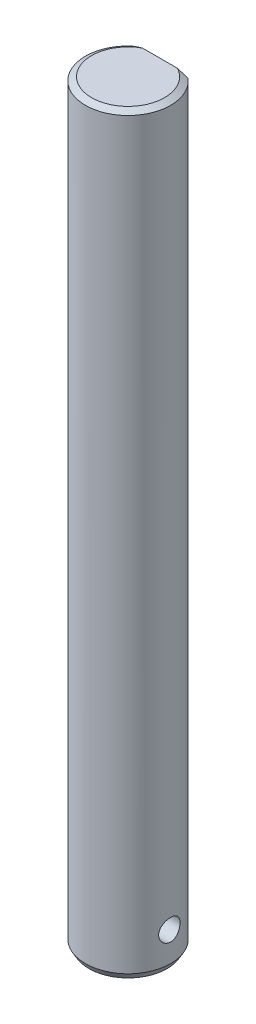
ISO-10303-21;
HEADER;
FILE_DESCRIPTION(('STEP AP214'),'2;1');
FILE_NAME('part.step','',(''),(''),'','','');
FILE_SCHEMA(('AUTOMOTIVE_DESIGN { 1 0 10303 214 1 1 1 1 }'));
ENDSEC;
DATA;
#1=APPLICATION_CONTEXT('core data for automotive mechanical design processes');
#2=APPLICATION_PROTOCOL_DEFINITION('international standard','automotive_design',2000,#1);
#3=PRODUCT_CONTEXT('',#1,'mechanical');
#4=PRODUCT('Part','Part','',(#3));
#5=PRODUCT_RELATED_PRODUCT_CATEGORY('part','',(#4));
#6=PRODUCT_DEFINITION_FORMATION('','',#4);
#7=PRODUCT_DEFINITION_CONTEXT('part definition',#1,'design');
#8=PRODUCT_DEFINITION('design','',#6,#7);
#9=PRODUCT_DEFINITION_SHAPE('','',#8);
#10=(LENGTH_UNIT() NAMED_UNIT(*) SI_UNIT(.MILLI.,.METRE.));
#11=(NAMED_UNIT(*) PLANE_ANGLE_UNIT() SI_UNIT($,.RADIAN.));
#12=(NAMED_UNIT(*) SI_UNIT($,.STERADIAN.) SOLID_ANGLE_UNIT());
#13=UNCERTAINTY_MEASURE_WITH_UNIT(LENGTH_MEASURE(1.E-05),#10,'distance_accuracy_value','');
#14=(GEOMETRIC_REPRESENTATION_CONTEXT(3) GLOBAL_UNCERTAINTY_ASSIGNED_CONTEXT((#13)) GLOBAL_UNIT_ASSIGNED_CONTEXT((#10,
#11,#12)) REPRESENTATION_CONTEXT('',''));
#15=CARTESIAN_POINT('',(0.,0.,0.));
#16=DIRECTION('',(0.,0.,1.));
#17=DIRECTION('',(1.,0.,0.));
#18=AXIS2_PLACEMENT_3D('',#15,#16,#17);
#19=CARTESIAN_POINT('',(0.,106.,0.));
#20=DIRECTION('',(0.,-1.,0.));
#21=DIRECTION('',(0.,0.,-1.));
#22=AXIS2_PLACEMENT_3D('',#19,#20,#21);
#23=CYLINDRICAL_SURFACE('',#22,6.);
#24=CARTESIAN_POINT('',(0.,0.866025403784429,0.));
#25=DIRECTION('',(0.,1.,0.));
#26=DIRECTION('',(0.,0.,1.));
#27=AXIS2_PLACEMENT_3D('',#24,#25,#26);
#28=CIRCLE('',#27,6.);
#29=CARTESIAN_POINT('',(0.,0.866025403784429,6.));
#30=VERTEX_POINT('',#29);
#31=EDGE_CURVE('E149',#30,#30,#28,.T.);
#32=ORIENTED_EDGE('',*,*,#31,.T.);
#33=EDGE_LOOP('',(#32));
#34=FACE_BOUND('',#33,.T.);
#35=CARTESIAN_POINT('',(-5.80947501931112,5.,-1.5));
#36=CARTESIAN_POINT('',(-5.80947660051185,5.08283045055477,-1.49999764715507));
#37=CARTESIAN_POINT('',(-5.81126583608348,5.1656869392068,-1.49311574729838));
#38=CARTESIAN_POINT('',(-5.81821117195949,5.32902054690442,-1.46581387527848));
#39=CARTESIAN_POINT('',(-5.82336923173088,5.409496252681,-1.44538602404532));
#40=CARTESIAN_POINT('',(-5.8364323475758,5.56568212291223,-1.39169471977917));
#41=CARTESIAN_POINT('',(-5.84433385614245,5.6413982932314,-1.35844783671268));
#42=CARTESIAN_POINT('',(-5.86198915217285,5.78618651152395,-1.28011268475685));
#43=CARTESIAN_POINT('',(-5.87174301827101,5.85525827724814,-1.23502391313642));
#44=CARTESIAN_POINT('',(-5.89224429813367,5.98631698715732,-1.13322505638712));
#45=CARTESIAN_POINT('',(-5.90300758573818,6.04813616021003,-1.07630213262243));
#46=CARTESIAN_POINT('',(-5.92417725309178,6.16145683661621,-0.952909238460398));
#47=CARTESIAN_POINT('',(-5.93458359939834,6.21295737537305,-0.886438376508184));
#48=CARTESIAN_POINT('',(-5.95404249312349,6.30486528057877,-0.744687120647372));
#49=CARTESIAN_POINT('',(-5.96307412440355,6.34510783289688,-0.669296745717071));
#50=CARTESIAN_POINT('',(-5.9785848715559,6.41228578649185,-0.512557910575656));
#51=CARTESIAN_POINT('',(-5.98506436400607,6.43922315114931,-0.431210331475164));
#52=CARTESIAN_POINT('',(-5.99462855308908,6.47848870074715,-0.266615255252497));
#53=CARTESIAN_POINT('',(-5.99777936306588,6.49110178659595,-0.183439631729385));
#54=CARTESIAN_POINT('',(-6.00056156464379,6.50225502756533,-0.0160972915576612));
#55=CARTESIAN_POINT('',(-6.00019347658022,6.50079726332576,0.0680692767228414));
#56=CARTESIAN_POINT('',(-5.99602856972121,6.48405508984991,0.233028370758581));
#57=CARTESIAN_POINT('',(-5.99230801404524,6.46907820496769,0.313854323401601));
#58=CARTESIAN_POINT('',(-5.98194501914912,6.4262172379709,0.47180737112053));
#59=CARTESIAN_POINT('',(-5.97530242439064,6.39833246877355,0.548934269055657));
#60=CARTESIAN_POINT('',(-5.95972505820537,6.33019845758776,0.69811005525271));
#61=CARTESIAN_POINT('',(-5.95077011817032,6.28983977320295,0.770106764649757));
#62=CARTESIAN_POINT('',(-5.93153942285789,6.19798659253025,0.906413433510733));
#63=CARTESIAN_POINT('',(-5.92126343791494,6.14649015886363,0.970722052628258));
#64=CARTESIAN_POINT('',(-5.90018228261712,6.03217475481058,1.09166105262743));
#65=CARTESIAN_POINT('',(-5.88937031715551,5.96908706459134,1.1480365186128));
#66=CARTESIAN_POINT('',(-5.86869026110024,5.83424001587585,1.24946456394453));
#67=CARTESIAN_POINT('',(-5.85882221463582,5.7624802523054,1.29451661406902));
#68=CARTESIAN_POINT('',(-5.84112298098989,5.61182597951062,1.3721821935339));
#69=CARTESIAN_POINT('',(-5.83330190235432,5.53289856181208,1.40473435045574));
#70=CARTESIAN_POINT('',(-5.82071184083974,5.37044871915413,1.45602843095451));
#71=CARTESIAN_POINT('',(-5.81594220486131,5.28692728161012,1.47477330982936));
#72=CARTESIAN_POINT('',(-5.81013213623484,5.12002429908613,1.49749778319911));
#73=CARTESIAN_POINT('',(-5.80899653456189,5.03669732400222,1.50185428435178));
#74=CARTESIAN_POINT('',(-5.81032406088624,4.8705068380531,1.49671019430933));
#75=CARTESIAN_POINT('',(-5.81278685760759,4.78764328522926,1.48721087870928));
#76=CARTESIAN_POINT('',(-5.82094249172736,4.62613144102718,1.4549552783626));
#77=CARTESIAN_POINT('',(-5.82658182140625,4.54743636405749,1.43241844096905));
#78=CARTESIAN_POINT('',(-5.84040430962577,4.39494112528899,1.37497084900237));
#79=CARTESIAN_POINT('',(-5.84858776949168,4.3211415445668,1.34005862862753));
#80=CARTESIAN_POINT('',(-5.86677682255957,4.17893523327959,1.25806240076193));
#81=CARTESIAN_POINT('',(-5.87681501163985,4.11066269597414,1.21075305230138));
#82=CARTESIAN_POINT('',(-5.8975024984303,3.98288698231919,1.10559043940168));
#83=CARTESIAN_POINT('',(-5.90815189637082,3.92338525000996,1.04773544220816));
#84=CARTESIAN_POINT('',(-5.92918441818964,3.81331337445743,0.921394081477089));
#85=CARTESIAN_POINT('',(-5.93955421237101,3.76300396247071,0.85267792879739));
#86=CARTESIAN_POINT('',(-5.9585832996824,3.67463847982925,0.707554024042014));
#87=CARTESIAN_POINT('',(-5.96724268202376,3.63658177003508,0.631146673436387));
#88=CARTESIAN_POINT('',(-5.98182069442988,3.57413237928324,0.473337302596636));
#89=CARTESIAN_POINT('',(-5.98775898013446,3.54964142937256,0.391976071541823));
#90=CARTESIAN_POINT('',(-5.99631176037473,3.51472379923495,0.226124640478213));
#91=CARTESIAN_POINT('',(-5.99892689636045,3.50429440475657,0.141635047561866));
#92=CARTESIAN_POINT('',(-6.00051254113217,3.4979486156367,-0.0256252896649889));
#93=CARTESIAN_POINT('',(-5.99957968320012,3.50164743635692,-0.108380740449049));
#94=CARTESIAN_POINT('',(-5.99438844686135,3.5225717409415,-0.272051244622109));
#95=CARTESIAN_POINT('',(-5.99013016735643,3.53979682251965,-0.352966352671329));
#96=CARTESIAN_POINT('',(-5.97878149280944,3.58707832965639,-0.510256553467224));
#97=CARTESIAN_POINT('',(-5.97170646753999,3.61706517997194,-0.586653741871528));
#98=CARTESIAN_POINT('',(-5.95546933370076,3.68895586852899,-0.733375579562202));
#99=CARTESIAN_POINT('',(-5.94630696206604,3.73086120900435,-0.803699461897577));
#100=CARTESIAN_POINT('',(-5.92660874521999,3.82657285099561,-0.938102892635849));
#101=CARTESIAN_POINT('',(-5.91604525418417,3.88064021436107,-1.00199248245088));
#102=CARTESIAN_POINT('',(-5.89485973579863,3.9986342779607,-1.11992253040688));
#103=CARTESIAN_POINT('',(-5.88423769428834,4.06256347414686,-1.17396048760228));
#104=CARTESIAN_POINT('',(-5.86391213790822,4.199902121302,-1.27164303971884));
#105=CARTESIAN_POINT('',(-5.85422945594827,4.27346618511894,-1.31507492916982));
#106=CARTESIAN_POINT('',(-5.83715933325923,4.42708323488405,-1.3888903449235));
#107=CARTESIAN_POINT('',(-5.82977022370054,4.50713144916011,-1.41928336463958));
#108=CARTESIAN_POINT('',(-5.81927863109675,4.65586551774008,-1.46163379284816));
#109=CARTESIAN_POINT('',(-5.8156299450082,4.72383974657579,-1.47598975589307));
#110=CARTESIAN_POINT('',(-5.81072757878358,4.86120330349995,-1.4951734388599));
#111=CARTESIAN_POINT('',(-5.80947369434945,4.93059251036759,-1.50000197155828));
#112=CARTESIAN_POINT('',(-5.80947501931112,5.,-1.5));
#113=B_SPLINE_CURVE_WITH_KNOTS('',3,(#35,#36,#37,#38,#39,#40,#41,#42,#43,#44,#45,#46,#47,#48,
#49,#50,#51,#52,#53,#54,#55,#56,#57,#58,#59,#60,#61,#62,#63,#64,#65,#66,#67,#68,#69,#70,#71,#72,
#73,#74,#75,#76,#77,#78,#79,#80,#81,#82,#83,#84,#85,#86,#87,#88,#89,#90,#91,#92,#93,#94,#95,#96,
#97,#98,#99,#100,#101,#102,#103,#104,#105,#106,#107,#108,#109,#110,#111,#112),.UNSPECIFIED.,.T.,
.F.,(4,2,2,2,2,2,2,2,2,2,2,2,2,2,2,2,2,2,2,2,2,2,2,2,2,2,2,2,2,2,2,2,2,2,2,2,2,2,4),(0.,
0.248236465041681,0.4966174448572,0.744678436299613,0.992749960532871,1.24574372515786,
1.4987611288792,1.75530897838752,2.01181895908255,2.26313250597208,2.51440889199612,
2.76010957613368,3.00582334034872,3.25375724552667,3.50173431281348,3.75642279943147,
4.01112318719881,4.26705859205041,4.52293920077728,4.7720614485703,5.02116076310281,
5.26618443005524,5.5112371285285,5.76109707515494,6.01099811331027,6.26715198579191,
6.52329249431732,6.77755243684157,7.03176329345423,7.27910067676474,7.52643070426189,
7.77242925935826,8.01845883442843,8.27038257949243,8.52237018939305,8.77905886370806,
9.03556032819972,9.24358696306398,9.45159585059712),.UNSPECIFIED.);
#114=CARTESIAN_POINT('',(-5.80947501931112,5.,-1.5));
#115=VERTEX_POINT('',#114);
#116=EDGE_CURVE('E97',#115,#115,#113,.T.);
#117=ORIENTED_EDGE('',*,*,#116,.T.);
#118=EDGE_LOOP('',(#117));
#119=FACE_BOUND('',#118,.T.);
#120=CARTESIAN_POINT('',(5.80947501931112,5.,-1.5));
#121=CARTESIAN_POINT('',(5.80947660051185,4.91716954944524,-1.49999764715507));
#122=CARTESIAN_POINT('',(5.81126583608348,4.8343130607932,-1.49311574729838));
#123=CARTESIAN_POINT('',(5.81821117195949,4.67097945309558,-1.46581387527848));
#124=CARTESIAN_POINT('',(5.82336923173088,4.590503747319,-1.44538602404532));
#125=CARTESIAN_POINT('',(5.8364323475758,4.43431787708778,-1.39169471977917));
#126=CARTESIAN_POINT('',(5.84433385614245,4.3586017067686,-1.35844783671268));
#127=CARTESIAN_POINT('',(5.86198915217285,4.21381348847605,-1.28011268475685));
#128=CARTESIAN_POINT('',(5.87174301827101,4.14474172275187,-1.23502391313642));
#129=CARTESIAN_POINT('',(5.89224429813367,4.01368301284268,-1.13322505638712));
#130=CARTESIAN_POINT('',(5.90300758573818,3.95186383978997,-1.07630213262243));
#131=CARTESIAN_POINT('',(5.92417725309178,3.83854316338379,-0.952909238460398));
#132=CARTESIAN_POINT('',(5.93458359939834,3.78704262462695,-0.886438376508184));
#133=CARTESIAN_POINT('',(5.95404249312349,3.69513471942123,-0.744687120647372));
#134=CARTESIAN_POINT('',(5.96307412440355,3.65489216710312,-0.669296745717072));
#135=CARTESIAN_POINT('',(5.9785848715559,3.58771421350815,-0.512557910575657));
#136=CARTESIAN_POINT('',(5.98506436400607,3.56077684885069,-0.431210331475164));
#137=CARTESIAN_POINT('',(5.99462855308908,3.52151129925285,-0.266615255252496));
#138=CARTESIAN_POINT('',(5.99777936306588,3.50889821340405,-0.183439631729385));
#139=CARTESIAN_POINT('',(6.00056156464379,3.49774497243467,-0.016097291557661));
#140=CARTESIAN_POINT('',(6.00019347658022,3.49920273667424,0.0680692767228418));
#141=CARTESIAN_POINT('',(5.99602856972121,3.51594491015009,0.233028370758582));
#142=CARTESIAN_POINT('',(5.99230801404524,3.53092179503231,0.313854323401601));
#143=CARTESIAN_POINT('',(5.98194501914912,3.5737827620291,0.47180737112053));
#144=CARTESIAN_POINT('',(5.97530242439064,3.60166753122645,0.548934269055657));
#145=CARTESIAN_POINT('',(5.95972505820537,3.66980154241224,0.69811005525271));
#146=CARTESIAN_POINT('',(5.95077011817032,3.71016022679705,0.770106764649757));
#147=CARTESIAN_POINT('',(5.93153942285789,3.80201340746976,0.906413433510734));
#148=CARTESIAN_POINT('',(5.92126343791494,3.85350984113637,0.970722052628259));
#149=CARTESIAN_POINT('',(5.90018228261712,3.96782524518943,1.09166105262743));
#150=CARTESIAN_POINT('',(5.88937031715551,4.03091293540867,1.1480365186128));
#151=CARTESIAN_POINT('',(5.86869026110024,4.16575998412415,1.24946456394453));
#152=CARTESIAN_POINT('',(5.85882221463582,4.2375197476946,1.29451661406903));
#153=CARTESIAN_POINT('',(5.84112298098989,4.38817402048938,1.3721821935339));
#154=CARTESIAN_POINT('',(5.83330190235432,4.46710143818792,1.40473435045574));
#155=CARTESIAN_POINT('',(5.82071184083974,4.62955128084587,1.45602843095451));
#156=CARTESIAN_POINT('',(5.81594220486131,4.71307271838988,1.47477330982937));
#157=CARTESIAN_POINT('',(5.81013213623484,4.87997570091387,1.49749778319911));
#158=CARTESIAN_POINT('',(5.80899653456189,4.96330267599778,1.50185428435178));
#159=CARTESIAN_POINT('',(5.81032406088624,5.1294931619469,1.49671019430933));
#160=CARTESIAN_POINT('',(5.8127868576076,5.21235671477075,1.48721087870928));
#161=CARTESIAN_POINT('',(5.82094249172736,5.37386855897283,1.4549552783626));
#162=CARTESIAN_POINT('',(5.82658182140625,5.45256363594251,1.43241844096905));
#163=CARTESIAN_POINT('',(5.84040430962577,5.60505887471101,1.37497084900237));
#164=CARTESIAN_POINT('',(5.84858776949168,5.6788584554332,1.34005862862753));
#165=CARTESIAN_POINT('',(5.86677682255957,5.82106476672041,1.25806240076193));
#166=CARTESIAN_POINT('',(5.87681501163985,5.88933730402586,1.21075305230138));
#167=CARTESIAN_POINT('',(5.89750249843029,6.01711301768081,1.10559043940168));
#168=CARTESIAN_POINT('',(5.90815189637082,6.07661474999005,1.04773544220816));
#169=CARTESIAN_POINT('',(5.92918441818964,6.18668662554258,0.921394081477088));
#170=CARTESIAN_POINT('',(5.93955421237101,6.23699603752929,0.852677928797389));
#171=CARTESIAN_POINT('',(5.9585832996824,6.32536152017075,0.707554024042013));
#172=CARTESIAN_POINT('',(5.96724268202376,6.36341822996492,0.631146673436386));
#173=CARTESIAN_POINT('',(5.98182069442988,6.42586762071676,0.473337302596635));
#174=CARTESIAN_POINT('',(5.98775898013446,6.45035857062744,0.391976071541821));
#175=CARTESIAN_POINT('',(5.99631176037473,6.48527620076505,0.226124640478211));
#176=CARTESIAN_POINT('',(5.99892689636045,6.49570559524343,0.141635047561864));
#177=CARTESIAN_POINT('',(6.00051254113217,6.5020513843633,-0.0256252896649908));
#178=CARTESIAN_POINT('',(5.99957968320012,6.49835256364309,-0.108380740449051));
#179=CARTESIAN_POINT('',(5.99438844686135,6.4774282590585,-0.27205124462211));
#180=CARTESIAN_POINT('',(5.99013016735643,6.46020317748035,-0.352966352671331));
#181=CARTESIAN_POINT('',(5.97878149280944,6.41292167034361,-0.510256553467225));
#182=CARTESIAN_POINT('',(5.97170646753999,6.38293482002806,-0.586653741871529));
#183=CARTESIAN_POINT('',(5.95546933370076,6.31104413147101,-0.733375579562203));
#184=CARTESIAN_POINT('',(5.94630696206604,6.26913879099565,-0.803699461897578));
#185=CARTESIAN_POINT('',(5.92660874521999,6.17342714900439,-0.93810289263585));
#186=CARTESIAN_POINT('',(5.91604525418417,6.11935978563893,-1.00199248245088));
#187=CARTESIAN_POINT('',(5.89485973579863,6.0013657220393,-1.11992253040688));
#188=CARTESIAN_POINT('',(5.88423769428834,5.93743652585314,-1.17396048760229));
#189=CARTESIAN_POINT('',(5.86391213790822,5.800097878698,-1.27164303971884));
#190=CARTESIAN_POINT('',(5.85422945594827,5.72653381488106,-1.31507492916982));
#191=CARTESIAN_POINT('',(5.83715933325923,5.57291676511595,-1.3888903449235));
#192=CARTESIAN_POINT('',(5.82977022370054,5.49286855083989,-1.41928336463958));
#193=CARTESIAN_POINT('',(5.81927863109675,5.34413448225992,-1.46163379284816));
#194=CARTESIAN_POINT('',(5.8156299450082,5.27616025342421,-1.47598975589307));
#195=CARTESIAN_POINT('',(5.81072757878358,5.13879669650005,-1.4951734388599));
#196=CARTESIAN_POINT('',(5.80947369434945,5.06940748963241,-1.50000197155828));
#197=CARTESIAN_POINT('',(5.80947501931112,5.,-1.5));
#198=B_SPLINE_CURVE_WITH_KNOTS('',3,(#120,#121,#122,#123,#124,#125,#126,#127,#128,#129,#130,
#131,#132,#133,#134,#135,#136,#137,#138,#139,#140,#141,#142,#143,#144,#145,#146,#147,#148,#149,
#150,#151,#152,#153,#154,#155,#156,#157,#158,#159,#160,#161,#162,#163,#164,#165,#166,#167,#168,
#169,#170,#171,#172,#173,#174,#175,#176,#177,#178,#179,#180,#181,#182,#183,#184,#185,#186,#187,
#188,#189,#190,#191,#192,#193,#194,#195,#196,#197),.UNSPECIFIED.,.T.,.F.,(4,2,2,2,2,2,2,2,2,2,2,
2,2,2,2,2,2,2,2,2,2,2,2,2,2,2,2,2,2,2,2,2,2,2,2,2,2,2,4),(0.,0.248236465041681,0.4966174448572,
0.744678436299613,0.992749960532871,1.24574372515786,1.4987611288792,1.75530897838752,
2.01181895908255,2.26313250597208,2.51440889199612,2.76010957613368,3.00582334034872,
3.25375724552667,3.50173431281348,3.75642279943147,4.01112318719881,4.26705859205042,
4.52293920077729,4.7720614485703,5.02116076310281,5.26618443005524,5.5112371285285,
5.76109707515494,6.01099811331027,6.26715198579191,6.52329249431732,6.77755243684157,
7.03176329345423,7.27910067676474,7.52643070426189,7.77242925935826,8.01845883442843,
8.27038257949243,8.52237018939305,8.77905886370806,9.03556032819972,9.24358696306398,
9.45159585059712),.UNSPECIFIED.);
#199=CARTESIAN_POINT('',(5.80947501931112,5.,-1.5));
#200=VERTEX_POINT('',#199);
#201=EDGE_CURVE('E103',#200,#200,#198,.T.);
#202=ORIENTED_EDGE('',*,*,#201,.T.);
#203=EDGE_LOOP('',(#202));
#204=FACE_BOUND('',#203,.T.);
#205=DIRECTION('',(0.,-1.,0.));
#206=VECTOR('',#205,1.);
#207=CARTESIAN_POINT('',(3.96862696659688,106.,-4.5));
#208=LINE('',#207,#206);
#209=CARTESIAN_POINT('',(3.96862696659688,96.,-4.5));
#210=VERTEX_POINT('',#209);
#211=CARTESIAN_POINT('',(3.96862696659688,105.5,-4.5));
#212=VERTEX_POINT('',#211);
#213=EDGE_CURVE('E86',#210,#212,#208,.F.);
#214=ORIENTED_EDGE('',*,*,#213,.T.);
#215=CARTESIAN_POINT('',(0.,105.5,0.));
#216=DIRECTION('',(0.,1.,0.));
#217=DIRECTION('',(0.,0.,1.));
#218=AXIS2_PLACEMENT_3D('',#215,#216,#217);
#219=CIRCLE('',#218,6.);
#220=CARTESIAN_POINT('',(-3.96862696659688,105.5,-4.5));
#221=VERTEX_POINT('',#220);
#222=EDGE_CURVE('E55',#212,#221,#219,.F.);
#223=ORIENTED_EDGE('',*,*,#222,.T.);
#224=DIRECTION('',(0.,-1.,0.));
#225=VECTOR('',#224,1.);
#226=CARTESIAN_POINT('',(-3.96862696659688,106.,-4.5));
#227=LINE('',#226,#225);
#228=CARTESIAN_POINT('',(-3.96862696659688,96.,-4.5));
#229=VERTEX_POINT('',#228);
#230=EDGE_CURVE('E79',#221,#229,#227,.T.);
#231=ORIENTED_EDGE('',*,*,#230,.T.);
#232=CARTESIAN_POINT('',(0.,96.,0.));
#233=DIRECTION('',(0.,1.,0.));
#234=DIRECTION('',(0.,0.,1.));
#235=AXIS2_PLACEMENT_3D('',#232,#233,#234);
#236=CIRCLE('',#235,6.);
#237=EDGE_CURVE('E81',#210,#229,#236,.T.);
#238=ORIENTED_EDGE('',*,*,#237,.F.);
#239=EDGE_LOOP('',(#214,#223,#231,#238));
#240=FACE_BOUND('',#239,.T.);
#241=ADVANCED_FACE('F45',(#34,#119,#204,#240),#23,.T.);
#242=CARTESIAN_POINT('',(0.,106.,0.));
#243=DIRECTION('',(0.,1.,0.));
#244=DIRECTION('',(0.,0.,1.));
#245=AXIS2_PLACEMENT_3D('',#242,#243,#244);
#246=PLANE('',#245);
#247=DIRECTION('',(1.,0.,0.));
#248=VECTOR('',#247,1.);
#249=CARTESIAN_POINT('',(0.,106.,-4.5));
#250=LINE('',#249,#248);
#251=CARTESIAN_POINT('',(-2.47137515456205,106.,-4.5));
#252=VERTEX_POINT('',#251);
#253=CARTESIAN_POINT('',(2.47137515456205,106.,-4.5));
#254=VERTEX_POINT('',#253);
#255=EDGE_CURVE('E85',#252,#254,#250,.T.);
#256=ORIENTED_EDGE('',*,*,#255,.F.);
#257=CARTESIAN_POINT('',(0.,106.,0.));
#258=DIRECTION('',(0.,1.,0.));
#259=DIRECTION('',(0.,0.,1.));
#260=AXIS2_PLACEMENT_3D('',#257,#258,#259);
#261=CIRCLE('',#260,5.13397459621555);
#262=EDGE_CURVE('E93',#252,#254,#261,.T.);
#263=ORIENTED_EDGE('',*,*,#262,.T.);
#264=EDGE_LOOP('',(#256,#263));
#265=FACE_BOUND('',#264,.T.);
#266=ADVANCED_FACE('F134',(#265),#246,.T.);
#267=CARTESIAN_POINT('',(0.,0.,0.));
#268=DIRECTION('',(0.,1.,0.));
#269=DIRECTION('',(0.,0.,1.));
#270=AXIS2_PLACEMENT_3D('',#267,#268,#269);
#271=PLANE('',#270);
#272=CARTESIAN_POINT('',(0.,0.,0.));
#273=DIRECTION('',(0.,1.,0.));
#274=DIRECTION('',(0.,0.,1.));
#275=AXIS2_PLACEMENT_3D('',#272,#273,#274);
#276=CIRCLE('',#275,5.49999999999999);
#277=CARTESIAN_POINT('',(0.,0.,5.49999999999999));
#278=VERTEX_POINT('',#277);
#279=EDGE_CURVE('E11',#278,#278,#276,.F.);
#280=ORIENTED_EDGE('',*,*,#279,.T.);
#281=EDGE_LOOP('',(#280));
#282=FACE_BOUND('',#281,.T.);
#283=ADVANCED_FACE('F130',(#282),#271,.F.);
#284=CARTESIAN_POINT('',(0.,96.,0.));
#285=DIRECTION('',(0.,1.,0.));
#286=DIRECTION('',(0.,0.,1.));
#287=AXIS2_PLACEMENT_3D('',#284,#285,#286);
#288=PLANE('',#287);
#289=ORIENTED_EDGE('',*,*,#237,.T.);
#290=DIRECTION('',(1.,0.,0.));
#291=VECTOR('',#290,1.);
#292=CARTESIAN_POINT('',(-17.6992479324592,96.,-4.5));
#293=LINE('',#292,#291);
#294=EDGE_CURVE('E91',#229,#210,#293,.T.);
#295=ORIENTED_EDGE('',*,*,#294,.T.);
#296=EDGE_LOOP('',(#289,#295));
#297=FACE_BOUND('',#296,.T.);
#298=ADVANCED_FACE('F90',(#297),#288,.T.);
#299=CARTESIAN_POINT('',(-17.6992479324592,96.,-4.5));
#300=DIRECTION('',(0.,0.,1.));
#301=DIRECTION('',(1.,0.,0.));
#302=AXIS2_PLACEMENT_3D('',#299,#300,#301);
#303=PLANE('',#302);
#304=ORIENTED_EDGE('',*,*,#255,.T.);
#305=CARTESIAN_POINT('',(2.47137515456205,106.,-4.5));
#306=CARTESIAN_POINT('',(2.59821029234088,105.964741067028,-4.5));
#307=CARTESIAN_POINT('',(2.72449842776641,105.927566203446,-4.5));
#308=CARTESIAN_POINT('',(2.97597185015971,105.849882020878,-4.5));
#309=CARTESIAN_POINT('',(3.10115769990571,105.809374527543,-4.5));
#310=CARTESIAN_POINT('',(3.35054029678142,105.725488234176,-4.5));
#311=CARTESIAN_POINT('',(3.47473716361616,105.682109787745,-4.5));
#312=CARTESIAN_POINT('',(3.72230196848672,105.592839293428,-4.5));
#313=CARTESIAN_POINT('',(3.84566941885811,105.54694589105,-4.5));
#314=CARTESIAN_POINT('',(3.96862696659688,105.5,-4.5));
#315=B_SPLINE_CURVE_WITH_KNOTS('',3,(#305,#306,#307,#308,#309,#310,#311,#312,#313,#314),
.UNSPECIFIED.,.F.,.F.,(4,2,2,2,4),(0.,0.394899349737703,0.789583791657935,1.18421971236833,
1.57907030390006),.UNSPECIFIED.);
#316=EDGE_CURVE('E69',#254,#212,#315,.T.);
#317=ORIENTED_EDGE('',*,*,#316,.T.);
#318=ORIENTED_EDGE('',*,*,#213,.F.);
#319=ORIENTED_EDGE('',*,*,#294,.F.);
#320=ORIENTED_EDGE('',*,*,#230,.F.);
#321=CARTESIAN_POINT('',(-3.96862696659688,105.5,-4.5));
#322=CARTESIAN_POINT('',(-3.84566941885811,105.54694589105,-4.5));
#323=CARTESIAN_POINT('',(-3.72230196848672,105.592839293428,-4.5));
#324=CARTESIAN_POINT('',(-3.47473716361616,105.682109787745,-4.5));
#325=CARTESIAN_POINT('',(-3.35054029678142,105.725488234176,-4.5));
#326=CARTESIAN_POINT('',(-3.10115769990571,105.809374527543,-4.5));
#327=CARTESIAN_POINT('',(-2.97597185015971,105.849882020878,-4.5));
#328=CARTESIAN_POINT('',(-2.72449842776641,105.927566203446,-4.5));
#329=CARTESIAN_POINT('',(-2.59821029234088,105.964741067028,-4.5));
#330=CARTESIAN_POINT('',(-2.47137515456205,106.,-4.5));
#331=B_SPLINE_CURVE_WITH_KNOTS('',3,(#321,#322,#323,#324,#325,#326,#327,#328,#329,#330),
.UNSPECIFIED.,.F.,.F.,(4,2,2,2,4),(0.,0.394850591531737,0.789486512242123,1.18417095416235,
1.57907030390006),.UNSPECIFIED.);
#332=EDGE_CURVE('E137',#221,#252,#331,.T.);
#333=ORIENTED_EDGE('',*,*,#332,.T.);
#334=EDGE_LOOP('',(#304,#317,#318,#319,#320,#333));
#335=FACE_BOUND('',#334,.T.);
#336=ADVANCED_FACE('F95',(#335),#303,.F.);
#337=CARTESIAN_POINT('',(-25.,5.,0.));
#338=DIRECTION('',(1.,0.,0.));
#339=DIRECTION('',(0.,0.,-1.));
#340=AXIS2_PLACEMENT_3D('',#337,#338,#339);
#341=CYLINDRICAL_SURFACE('',#340,1.5);
#342=ORIENTED_EDGE('',*,*,#201,.F.);
#343=EDGE_LOOP('',(#342));
#344=FACE_BOUND('',#343,.T.);
#345=ORIENTED_EDGE('',*,*,#116,.F.);
#346=EDGE_LOOP('',(#345));
#347=FACE_BOUND('',#346,.T.);
#348=ADVANCED_FACE('F121',(#344,#347),#341,.F.);
#349=CARTESIAN_POINT('',(0.,106.,0.));
#350=DIRECTION('',(0.,-1.,0.));
#351=DIRECTION('',(0.,0.,-1.));
#352=AXIS2_PLACEMENT_3D('',#349,#350,#351);
#353=CONICAL_SURFACE('',#352,5.13397459621555,1.0471975511966);
#354=ORIENTED_EDGE('',*,*,#332,.F.);
#355=ORIENTED_EDGE('',*,*,#222,.F.);
#356=ORIENTED_EDGE('',*,*,#316,.F.);
#357=ORIENTED_EDGE('',*,*,#262,.F.);
#358=EDGE_LOOP('',(#354,#355,#356,#357));
#359=FACE_BOUND('',#358,.T.);
#360=ADVANCED_FACE('F125',(#359),#353,.T.);
#361=CARTESIAN_POINT('',(0.,0.866025403784429,0.));
#362=DIRECTION('',(0.,1.,0.));
#363=DIRECTION('',(0.,0.,1.));
#364=AXIS2_PLACEMENT_3D('',#361,#362,#363);
#365=CONICAL_SURFACE('',#364,6.,0.523598775598311);
#366=ORIENTED_EDGE('',*,*,#279,.F.);
#367=EDGE_LOOP('',(#366));
#368=FACE_BOUND('',#367,.T.);
#369=ORIENTED_EDGE('',*,*,#31,.F.);
#370=EDGE_LOOP('',(#369));
#371=FACE_BOUND('',#370,.T.);
#372=ADVANCED_FACE('F48',(#368,#371),#365,.T.);
#373=CLOSED_SHELL('',(#241,#266,#283,#298,#336,#348,#360,#372));
#374=MANIFOLD_SOLID_BREP('B2',#373);
#375=ADVANCED_BREP_SHAPE_REPRESENTATION('',(#18,#374),#14);
#376=SHAPE_DEFINITION_REPRESENTATION(#9,#375);
ENDSEC;
END-ISO-10303-21;
